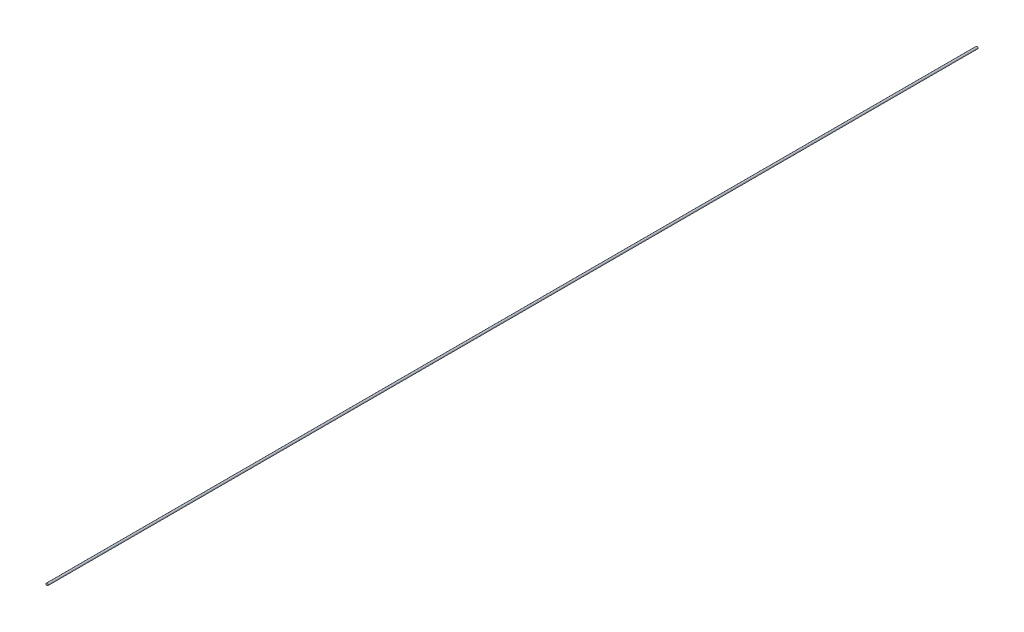
ISO-10303-21;
HEADER;
FILE_DESCRIPTION(('STEP AP214'),'2;1');
FILE_NAME('part.step','',(''),(''),'','','');
FILE_SCHEMA(('AUTOMOTIVE_DESIGN { 1 0 10303 214 1 1 1 1 }'));
ENDSEC;
DATA;
#1=APPLICATION_CONTEXT('core data for automotive mechanical design processes');
#2=APPLICATION_PROTOCOL_DEFINITION('international standard','automotive_design',2000,#1);
#3=PRODUCT_CONTEXT('',#1,'mechanical');
#4=PRODUCT('Part','Part','',(#3));
#5=PRODUCT_RELATED_PRODUCT_CATEGORY('part','',(#4));
#6=PRODUCT_DEFINITION_FORMATION('','',#4);
#7=PRODUCT_DEFINITION_CONTEXT('part definition',#1,'design');
#8=PRODUCT_DEFINITION('design','',#6,#7);
#9=PRODUCT_DEFINITION_SHAPE('','',#8);
#10=(LENGTH_UNIT() NAMED_UNIT(*) SI_UNIT(.MILLI.,.METRE.));
#11=(NAMED_UNIT(*) PLANE_ANGLE_UNIT() SI_UNIT($,.RADIAN.));
#12=(NAMED_UNIT(*) SI_UNIT($,.STERADIAN.) SOLID_ANGLE_UNIT());
#13=UNCERTAINTY_MEASURE_WITH_UNIT(LENGTH_MEASURE(1.E-05),#10,'distance_accuracy_value','');
#14=(GEOMETRIC_REPRESENTATION_CONTEXT(3) GLOBAL_UNCERTAINTY_ASSIGNED_CONTEXT((#13)) GLOBAL_UNIT_ASSIGNED_CONTEXT((#10,
#11,#12)) REPRESENTATION_CONTEXT('',''));
#15=CARTESIAN_POINT('',(0.,0.,0.));
#16=DIRECTION('',(0.,0.,1.));
#17=DIRECTION('',(1.,0.,0.));
#18=AXIS2_PLACEMENT_3D('',#15,#16,#17);
#19=CARTESIAN_POINT('',(0.,0.,133.));
#20=DIRECTION('',(0.,0.,-1.));
#21=DIRECTION('',(-1.,0.,0.));
#22=AXIS2_PLACEMENT_3D('',#19,#20,#21);
#23=CYLINDRICAL_SURFACE('',#22,0.15);
#24=CARTESIAN_POINT('',(0.,0.,133.));
#25=DIRECTION('',(0.,0.,1.));
#26=DIRECTION('',(1.,0.,0.));
#27=AXIS2_PLACEMENT_3D('',#24,#25,#26);
#28=CIRCLE('',#27,0.15);
#29=CARTESIAN_POINT('',(0.15,0.,133.));
#30=VERTEX_POINT('',#29);
#31=EDGE_CURVE('E10',#30,#30,#28,.T.);
#32=ORIENTED_EDGE('',*,*,#31,.F.);
#33=EDGE_LOOP('',(#32));
#34=FACE_BOUND('',#33,.T.);
#35=CARTESIAN_POINT('',(0.,0.,0.));
#36=DIRECTION('',(0.,0.,1.));
#37=DIRECTION('',(1.,0.,0.));
#38=AXIS2_PLACEMENT_3D('',#35,#36,#37);
#39=CIRCLE('',#38,0.15);
#40=CARTESIAN_POINT('',(0.15,0.,0.));
#41=VERTEX_POINT('',#40);
#42=EDGE_CURVE('E35',#41,#41,#39,.T.);
#43=ORIENTED_EDGE('',*,*,#42,.T.);
#44=EDGE_LOOP('',(#43));
#45=FACE_BOUND('',#44,.T.);
#46=ADVANCED_FACE('F32',(#34,#45),#23,.T.);
#47=CARTESIAN_POINT('',(0.,0.,133.));
#48=DIRECTION('',(0.,0.,1.));
#49=DIRECTION('',(1.,0.,0.));
#50=AXIS2_PLACEMENT_3D('',#47,#48,#49);
#51=PLANE('',#50);
#52=ORIENTED_EDGE('',*,*,#31,.T.);
#53=EDGE_LOOP('',(#52));
#54=FACE_BOUND('',#53,.T.);
#55=ADVANCED_FACE('F47',(#54),#51,.T.);
#56=CARTESIAN_POINT('',(0.,0.,0.));
#57=DIRECTION('',(0.,0.,1.));
#58=DIRECTION('',(1.,0.,0.));
#59=AXIS2_PLACEMENT_3D('',#56,#57,#58);
#60=PLANE('',#59);
#61=ORIENTED_EDGE('',*,*,#42,.F.);
#62=EDGE_LOOP('',(#61));
#63=FACE_BOUND('',#62,.T.);
#64=ADVANCED_FACE('F45',(#63),#60,.F.);
#65=CLOSED_SHELL('',(#46,#55,#64));
#66=MANIFOLD_SOLID_BREP('B2',#65);
#67=ADVANCED_BREP_SHAPE_REPRESENTATION('',(#18,#66),#14);
#68=SHAPE_DEFINITION_REPRESENTATION(#9,#67);
ENDSEC;
END-ISO-10303-21;
